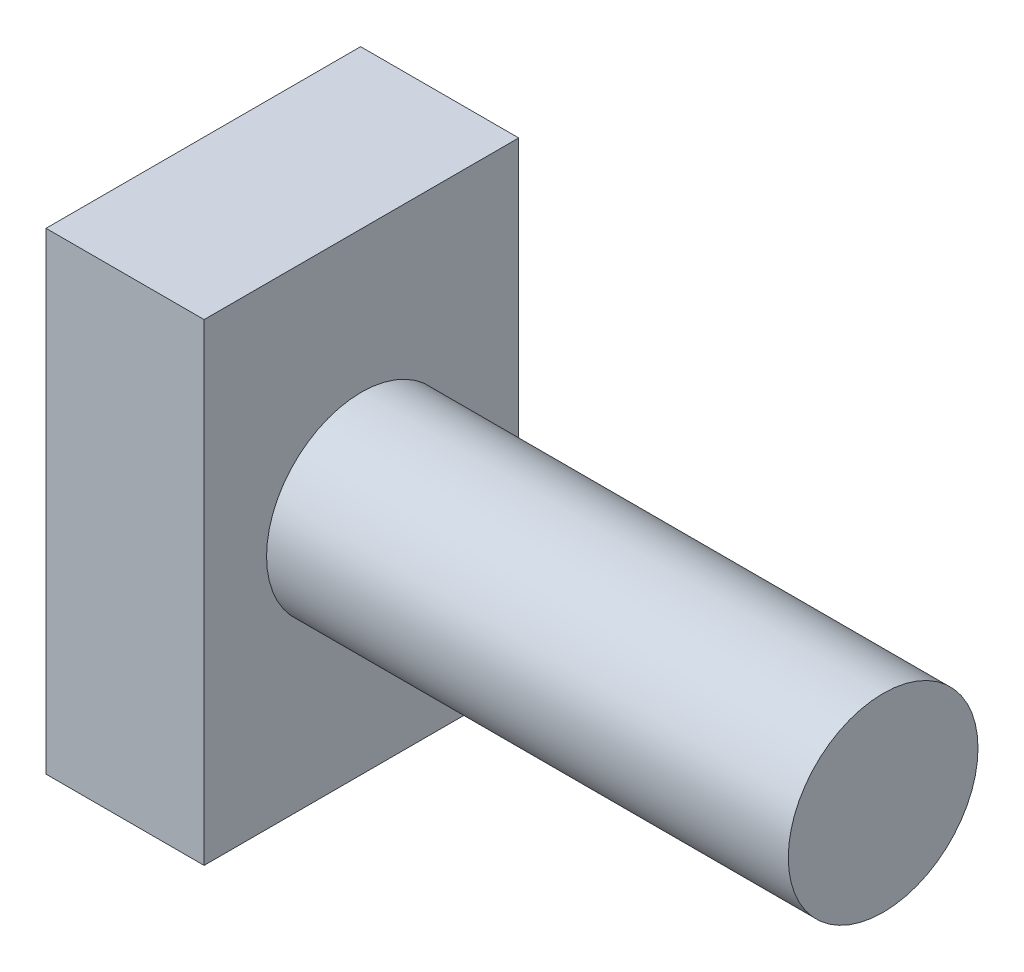
ISO-10303-21;
HEADER;
FILE_DESCRIPTION(('STEP AP214'),'2;1');
FILE_NAME('part.step','',(''),(''),'','','');
FILE_SCHEMA(('AUTOMOTIVE_DESIGN { 1 0 10303 214 1 1 1 1 }'));
ENDSEC;
DATA;
#1=APPLICATION_CONTEXT('core data for automotive mechanical design processes');
#2=APPLICATION_PROTOCOL_DEFINITION('international standard','automotive_design',2000,#1);
#3=PRODUCT_CONTEXT('',#1,'mechanical');
#4=PRODUCT('Part','Part','',(#3));
#5=PRODUCT_RELATED_PRODUCT_CATEGORY('part','',(#4));
#6=PRODUCT_DEFINITION_FORMATION('','',#4);
#7=PRODUCT_DEFINITION_CONTEXT('part definition',#1,'design');
#8=PRODUCT_DEFINITION('design','',#6,#7);
#9=PRODUCT_DEFINITION_SHAPE('','',#8);
#10=(LENGTH_UNIT() NAMED_UNIT(*) SI_UNIT(.MILLI.,.METRE.));
#11=(NAMED_UNIT(*) PLANE_ANGLE_UNIT() SI_UNIT($,.RADIAN.));
#12=(NAMED_UNIT(*) SI_UNIT($,.STERADIAN.) SOLID_ANGLE_UNIT());
#13=UNCERTAINTY_MEASURE_WITH_UNIT(LENGTH_MEASURE(1.E-05),#10,'distance_accuracy_value','');
#14=(GEOMETRIC_REPRESENTATION_CONTEXT(3) GLOBAL_UNCERTAINTY_ASSIGNED_CONTEXT((#13)) GLOBAL_UNIT_ASSIGNED_CONTEXT((#10,
#11,#12)) REPRESENTATION_CONTEXT('',''));
#15=CARTESIAN_POINT('',(0.,0.,0.));
#16=DIRECTION('',(0.,0.,1.));
#17=DIRECTION('',(1.,0.,0.));
#18=AXIS2_PLACEMENT_3D('',#15,#16,#17);
#19=CARTESIAN_POINT('',(5.00000000000001,29.9,-9.95));
#20=DIRECTION('',(-1.,0.,0.));
#21=DIRECTION('',(0.,0.,1.));
#22=AXIS2_PLACEMENT_3D('',#19,#20,#21);
#23=PLANE('',#22);
#24=CARTESIAN_POINT('',(5.00000000000001,14.95,0.));
#25=DIRECTION('',(1.,0.,0.));
#26=DIRECTION('',(0.,0.,-1.));
#27=AXIS2_PLACEMENT_3D('',#24,#25,#26);
#28=CIRCLE('',#27,6.);
#29=CARTESIAN_POINT('',(5.00000000000001,14.95,-6.));
#30=VERTEX_POINT('',#29);
#31=EDGE_CURVE('E11',#30,#30,#28,.T.);
#32=ORIENTED_EDGE('',*,*,#31,.F.);
#33=EDGE_LOOP('',(#32));
#34=FACE_BOUND('',#33,.T.);
#35=DIRECTION('',(0.,0.,-1.));
#36=VECTOR('',#35,1.);
#37=CARTESIAN_POINT('',(5.00000000000001,0.,-9.95));
#38=LINE('',#37,#36);
#39=CARTESIAN_POINT('',(5.00000000000001,0.,9.95));
#40=VERTEX_POINT('',#39);
#41=CARTESIAN_POINT('',(5.00000000000001,0.,-9.95));
#42=VERTEX_POINT('',#41);
#43=EDGE_CURVE('E105',#40,#42,#38,.T.);
#44=ORIENTED_EDGE('',*,*,#43,.T.);
#45=DIRECTION('',(0.,-1.,0.));
#46=VECTOR('',#45,1.);
#47=CARTESIAN_POINT('',(5.00000000000001,29.9,-9.95));
#48=LINE('',#47,#46);
#49=CARTESIAN_POINT('',(5.00000000000001,29.9,-9.95));
#50=VERTEX_POINT('',#49);
#51=EDGE_CURVE('E42',#50,#42,#48,.T.);
#52=ORIENTED_EDGE('',*,*,#51,.F.);
#53=DIRECTION('',(0.,0.,-1.));
#54=VECTOR('',#53,1.);
#55=CARTESIAN_POINT('',(5.00000000000001,29.9,-9.95));
#56=LINE('',#55,#54);
#57=CARTESIAN_POINT('',(5.00000000000001,29.9,9.95));
#58=VERTEX_POINT('',#57);
#59=EDGE_CURVE('E92',#58,#50,#56,.T.);
#60=ORIENTED_EDGE('',*,*,#59,.F.);
#61=DIRECTION('',(0.,-1.,0.));
#62=VECTOR('',#61,1.);
#63=CARTESIAN_POINT('',(5.00000000000001,29.9,9.95));
#64=LINE('',#63,#62);
#65=EDGE_CURVE('E101',#58,#40,#64,.T.);
#66=ORIENTED_EDGE('',*,*,#65,.T.);
#67=EDGE_LOOP('',(#44,#52,#60,#66));
#68=FACE_BOUND('',#67,.T.);
#69=ADVANCED_FACE('F39',(#34,#68),#23,.F.);
#70=CARTESIAN_POINT('',(-4.99999999999999,29.9,-9.95));
#71=DIRECTION('',(0.,0.,1.));
#72=DIRECTION('',(1.,0.,0.));
#73=AXIS2_PLACEMENT_3D('',#70,#71,#72);
#74=PLANE('',#73);
#75=DIRECTION('',(-1.,0.,0.));
#76=VECTOR('',#75,1.);
#77=CARTESIAN_POINT('',(-4.99999999999999,0.,-9.95));
#78=LINE('',#77,#76);
#79=CARTESIAN_POINT('',(-4.99999999999999,0.,-9.95));
#80=VERTEX_POINT('',#79);
#81=EDGE_CURVE('E97',#42,#80,#78,.T.);
#82=ORIENTED_EDGE('',*,*,#81,.T.);
#83=DIRECTION('',(0.,-1.,0.));
#84=VECTOR('',#83,1.);
#85=CARTESIAN_POINT('',(-4.99999999999999,29.9,-9.95));
#86=LINE('',#85,#84);
#87=CARTESIAN_POINT('',(-4.99999999999999,29.9,-9.95));
#88=VERTEX_POINT('',#87);
#89=EDGE_CURVE('E95',#88,#80,#86,.T.);
#90=ORIENTED_EDGE('',*,*,#89,.F.);
#91=DIRECTION('',(-1.,0.,0.));
#92=VECTOR('',#91,1.);
#93=CARTESIAN_POINT('',(-4.99999999999999,29.9,-9.95));
#94=LINE('',#93,#92);
#95=EDGE_CURVE('E87',#50,#88,#94,.T.);
#96=ORIENTED_EDGE('',*,*,#95,.F.);
#97=ORIENTED_EDGE('',*,*,#51,.T.);
#98=EDGE_LOOP('',(#82,#90,#96,#97));
#99=FACE_BOUND('',#98,.T.);
#100=ADVANCED_FACE('F96',(#99),#74,.F.);
#101=CARTESIAN_POINT('',(-4.99999999999999,29.9,-9.95));
#102=DIRECTION('',(1.,0.,0.));
#103=DIRECTION('',(0.,0.,-1.));
#104=AXIS2_PLACEMENT_3D('',#101,#102,#103);
#105=PLANE('',#104);
#106=CARTESIAN_POINT('',(-4.99999999999999,14.95,0.));
#107=DIRECTION('',(-1.,0.,0.));
#108=DIRECTION('',(0.,0.,1.));
#109=AXIS2_PLACEMENT_3D('',#106,#107,#108);
#110=CIRCLE('',#109,2.);
#111=CARTESIAN_POINT('',(-4.99999999999999,14.95,2.));
#112=VERTEX_POINT('',#111);
#113=EDGE_CURVE('E122',#112,#112,#110,.T.);
#114=ORIENTED_EDGE('',*,*,#113,.F.);
#115=EDGE_LOOP('',(#114));
#116=FACE_BOUND('',#115,.T.);
#117=DIRECTION('',(0.,0.,1.));
#118=VECTOR('',#117,1.);
#119=CARTESIAN_POINT('',(-4.99999999999999,0.,-9.95));
#120=LINE('',#119,#118);
#121=CARTESIAN_POINT('',(-4.99999999999999,0.,9.95));
#122=VERTEX_POINT('',#121);
#123=EDGE_CURVE('E73',#80,#122,#120,.T.);
#124=ORIENTED_EDGE('',*,*,#123,.T.);
#125=DIRECTION('',(0.,-1.,0.));
#126=VECTOR('',#125,1.);
#127=CARTESIAN_POINT('',(-4.99999999999999,29.9,9.95));
#128=LINE('',#127,#126);
#129=CARTESIAN_POINT('',(-4.99999999999999,29.9,9.95));
#130=VERTEX_POINT('',#129);
#131=EDGE_CURVE('E98',#130,#122,#128,.T.);
#132=ORIENTED_EDGE('',*,*,#131,.F.);
#133=DIRECTION('',(0.,0.,1.));
#134=VECTOR('',#133,1.);
#135=CARTESIAN_POINT('',(-4.99999999999999,29.9,-9.95));
#136=LINE('',#135,#134);
#137=EDGE_CURVE('E90',#88,#130,#136,.T.);
#138=ORIENTED_EDGE('',*,*,#137,.F.);
#139=ORIENTED_EDGE('',*,*,#89,.T.);
#140=EDGE_LOOP('',(#124,#132,#138,#139));
#141=FACE_BOUND('',#140,.T.);
#142=ADVANCED_FACE('F99',(#116,#141),#105,.F.);
#143=CARTESIAN_POINT('',(-4.99999999999999,29.9,9.95));
#144=DIRECTION('',(0.,0.,-1.));
#145=DIRECTION('',(-1.,0.,0.));
#146=AXIS2_PLACEMENT_3D('',#143,#144,#145);
#147=PLANE('',#146);
#148=DIRECTION('',(1.,0.,0.));
#149=VECTOR('',#148,1.);
#150=CARTESIAN_POINT('',(-4.99999999999999,0.,9.95));
#151=LINE('',#150,#149);
#152=EDGE_CURVE('E79',#122,#40,#151,.T.);
#153=ORIENTED_EDGE('',*,*,#152,.T.);
#154=ORIENTED_EDGE('',*,*,#65,.F.);
#155=DIRECTION('',(1.,0.,0.));
#156=VECTOR('',#155,1.);
#157=CARTESIAN_POINT('',(-4.99999999999999,29.9,9.95));
#158=LINE('',#157,#156);
#159=EDGE_CURVE('E56',#130,#58,#158,.T.);
#160=ORIENTED_EDGE('',*,*,#159,.F.);
#161=ORIENTED_EDGE('',*,*,#131,.T.);
#162=EDGE_LOOP('',(#153,#154,#160,#161));
#163=FACE_BOUND('',#162,.T.);
#164=ADVANCED_FACE('F113',(#163),#147,.F.);
#165=CARTESIAN_POINT('',(0.,29.9,0.));
#166=DIRECTION('',(0.,1.,0.));
#167=DIRECTION('',(0.,0.,1.));
#168=AXIS2_PLACEMENT_3D('',#165,#166,#167);
#169=PLANE('',#168);
#170=ORIENTED_EDGE('',*,*,#59,.T.);
#171=ORIENTED_EDGE('',*,*,#95,.T.);
#172=ORIENTED_EDGE('',*,*,#137,.T.);
#173=ORIENTED_EDGE('',*,*,#159,.T.);
#174=EDGE_LOOP('',(#170,#171,#172,#173));
#175=FACE_BOUND('',#174,.T.);
#176=ADVANCED_FACE('F88',(#175),#169,.T.);
#177=CARTESIAN_POINT('',(0.,0.,0.));
#178=DIRECTION('',(0.,1.,0.));
#179=DIRECTION('',(0.,0.,1.));
#180=AXIS2_PLACEMENT_3D('',#177,#178,#179);
#181=PLANE('',#180);
#182=ORIENTED_EDGE('',*,*,#43,.F.);
#183=ORIENTED_EDGE('',*,*,#152,.F.);
#184=ORIENTED_EDGE('',*,*,#123,.F.);
#185=ORIENTED_EDGE('',*,*,#81,.F.);
#186=EDGE_LOOP('',(#182,#183,#184,#185));
#187=FACE_BOUND('',#186,.T.);
#188=ADVANCED_FACE('F116',(#187),#181,.F.);
#189=CARTESIAN_POINT('',(38.,14.95,0.));
#190=DIRECTION('',(-1.,0.,0.));
#191=DIRECTION('',(0.,0.,1.));
#192=AXIS2_PLACEMENT_3D('',#189,#190,#191);
#193=CYLINDRICAL_SURFACE('',#192,6.);
#194=CARTESIAN_POINT('',(38.,14.95,0.));
#195=DIRECTION('',(1.,0.,0.));
#196=DIRECTION('',(0.,0.,-1.));
#197=AXIS2_PLACEMENT_3D('',#194,#195,#196);
#198=CIRCLE('',#197,6.);
#199=CARTESIAN_POINT('',(38.,14.95,-6.));
#200=VERTEX_POINT('',#199);
#201=EDGE_CURVE('E108',#200,#200,#198,.T.);
#202=ORIENTED_EDGE('',*,*,#201,.F.);
#203=EDGE_LOOP('',(#202));
#204=FACE_BOUND('',#203,.T.);
#205=ORIENTED_EDGE('',*,*,#31,.T.);
#206=EDGE_LOOP('',(#205));
#207=FACE_BOUND('',#206,.T.);
#208=ADVANCED_FACE('F150',(#204,#207),#193,.T.);
#209=CARTESIAN_POINT('',(38.,14.95,0.));
#210=DIRECTION('',(1.,0.,0.));
#211=DIRECTION('',(0.,0.,-1.));
#212=AXIS2_PLACEMENT_3D('',#209,#210,#211);
#213=PLANE('',#212);
#214=ORIENTED_EDGE('',*,*,#201,.T.);
#215=EDGE_LOOP('',(#214));
#216=FACE_BOUND('',#215,.T.);
#217=ADVANCED_FACE('F133',(#216),#213,.T.);
#218=CARTESIAN_POINT('',(4.60000000000001,14.95,0.));
#219=DIRECTION('',(-1.,0.,0.));
#220=DIRECTION('',(0.,0.,1.));
#221=AXIS2_PLACEMENT_3D('',#218,#219,#220);
#222=CYLINDRICAL_SURFACE('',#221,2.);
#223=CARTESIAN_POINT('',(4.60000000000001,14.95,0.));
#224=DIRECTION('',(-1.,0.,0.));
#225=DIRECTION('',(0.,0.,1.));
#226=AXIS2_PLACEMENT_3D('',#223,#224,#225);
#227=CIRCLE('',#226,2.);
#228=CARTESIAN_POINT('',(4.60000000000001,14.95,2.));
#229=VERTEX_POINT('',#228);
#230=EDGE_CURVE('E121',#229,#229,#227,.T.);
#231=ORIENTED_EDGE('',*,*,#230,.F.);
#232=EDGE_LOOP('',(#231));
#233=FACE_BOUND('',#232,.T.);
#234=ORIENTED_EDGE('',*,*,#113,.T.);
#235=EDGE_LOOP('',(#234));
#236=FACE_BOUND('',#235,.T.);
#237=ADVANCED_FACE('F130',(#233,#236),#222,.F.);
#238=CARTESIAN_POINT('',(4.60000000000001,14.95,0.));
#239=DIRECTION('',(-1.,0.,0.));
#240=DIRECTION('',(0.,0.,1.));
#241=AXIS2_PLACEMENT_3D('',#238,#239,#240);
#242=PLANE('',#241);
#243=ORIENTED_EDGE('',*,*,#230,.T.);
#244=EDGE_LOOP('',(#243));
#245=FACE_BOUND('',#244,.T.);
#246=ADVANCED_FACE('F128',(#245),#242,.T.);
#247=CLOSED_SHELL('',(#69,#100,#142,#164,#176,#188,#208,#217,#237,#246));
#248=MANIFOLD_SOLID_BREP('B2',#247);
#249=ADVANCED_BREP_SHAPE_REPRESENTATION('',(#18,#248),#14);
#250=SHAPE_DEFINITION_REPRESENTATION(#9,#249);
ENDSEC;
END-ISO-10303-21;
